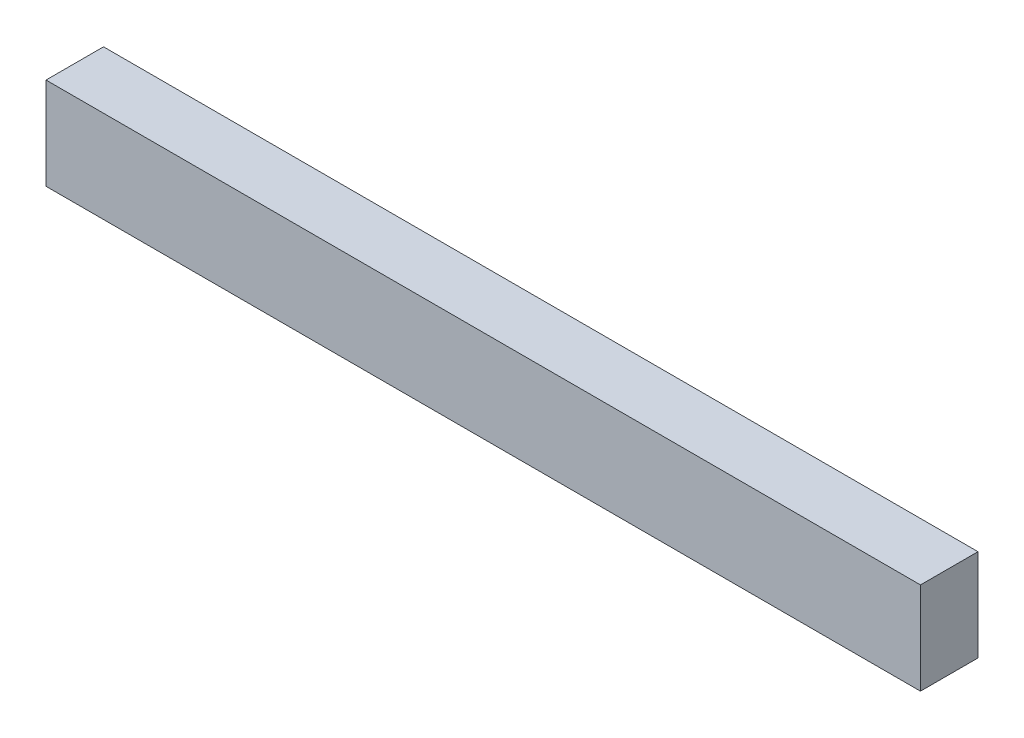
ISO-10303-21;
HEADER;
FILE_DESCRIPTION(('STEP AP214'),'2;1');
FILE_NAME('part.step','',(''),(''),'','','');
FILE_SCHEMA(('AUTOMOTIVE_DESIGN { 1 0 10303 214 1 1 1 1 }'));
ENDSEC;
DATA;
#1=APPLICATION_CONTEXT('core data for automotive mechanical design processes');
#2=APPLICATION_PROTOCOL_DEFINITION('international standard','automotive_design',2000,#1);
#3=PRODUCT_CONTEXT('',#1,'mechanical');
#4=PRODUCT('Part','Part','',(#3));
#5=PRODUCT_RELATED_PRODUCT_CATEGORY('part','',(#4));
#6=PRODUCT_DEFINITION_FORMATION('','',#4);
#7=PRODUCT_DEFINITION_CONTEXT('part definition',#1,'design');
#8=PRODUCT_DEFINITION('design','',#6,#7);
#9=PRODUCT_DEFINITION_SHAPE('','',#8);
#10=(LENGTH_UNIT() NAMED_UNIT(*) SI_UNIT(.MILLI.,.METRE.));
#11=(NAMED_UNIT(*) PLANE_ANGLE_UNIT() SI_UNIT($,.RADIAN.));
#12=(NAMED_UNIT(*) SI_UNIT($,.STERADIAN.) SOLID_ANGLE_UNIT());
#13=UNCERTAINTY_MEASURE_WITH_UNIT(LENGTH_MEASURE(1.E-05),#10,'distance_accuracy_value','');
#14=(GEOMETRIC_REPRESENTATION_CONTEXT(3) GLOBAL_UNCERTAINTY_ASSIGNED_CONTEXT((#13)) GLOBAL_UNIT_ASSIGNED_CONTEXT((#10,
#11,#12)) REPRESENTATION_CONTEXT('',''));
#15=CARTESIAN_POINT('',(0.,0.,0.));
#16=DIRECTION('',(0.,0.,1.));
#17=DIRECTION('',(1.,0.,0.));
#18=AXIS2_PLACEMENT_3D('',#15,#16,#17);
#19=CARTESIAN_POINT('',(190.,-20.,25.));
#20=DIRECTION('',(-1.,0.,0.));
#21=DIRECTION('',(0.,0.,1.));
#22=AXIS2_PLACEMENT_3D('',#19,#20,#21);
#23=PLANE('',#22);
#24=DIRECTION('',(0.,1.,0.));
#25=VECTOR('',#24,1.);
#26=CARTESIAN_POINT('',(190.,-20.,0.));
#27=LINE('',#26,#25);
#28=CARTESIAN_POINT('',(190.,-20.,0.));
#29=VERTEX_POINT('',#28);
#30=CARTESIAN_POINT('',(190.,20.,0.));
#31=VERTEX_POINT('',#30);
#32=EDGE_CURVE('E80',#29,#31,#27,.T.);
#33=ORIENTED_EDGE('',*,*,#32,.T.);
#34=DIRECTION('',(0.,0.,-1.));
#35=VECTOR('',#34,1.);
#36=CARTESIAN_POINT('',(190.,20.,25.));
#37=LINE('',#36,#35);
#38=CARTESIAN_POINT('',(190.,20.,25.));
#39=VERTEX_POINT('',#38);
#40=EDGE_CURVE('E11',#39,#31,#37,.T.);
#41=ORIENTED_EDGE('',*,*,#40,.F.);
#42=DIRECTION('',(0.,1.,0.));
#43=VECTOR('',#42,1.);
#44=CARTESIAN_POINT('',(190.,-20.,25.));
#45=LINE('',#44,#43);
#46=CARTESIAN_POINT('',(190.,-20.,25.));
#47=VERTEX_POINT('',#46);
#48=EDGE_CURVE('E68',#47,#39,#45,.T.);
#49=ORIENTED_EDGE('',*,*,#48,.F.);
#50=DIRECTION('',(0.,0.,-1.));
#51=VECTOR('',#50,1.);
#52=CARTESIAN_POINT('',(190.,-20.,25.));
#53=LINE('',#52,#51);
#54=EDGE_CURVE('E76',#47,#29,#53,.T.);
#55=ORIENTED_EDGE('',*,*,#54,.T.);
#56=EDGE_LOOP('',(#33,#41,#49,#55));
#57=FACE_BOUND('',#56,.T.);
#58=ADVANCED_FACE('F17',(#57),#23,.F.);
#59=CARTESIAN_POINT('',(-190.,20.,25.));
#60=DIRECTION('',(0.,-1.,0.));
#61=DIRECTION('',(0.,0.,-1.));
#62=AXIS2_PLACEMENT_3D('',#59,#60,#61);
#63=PLANE('',#62);
#64=DIRECTION('',(-1.,0.,0.));
#65=VECTOR('',#64,1.);
#66=CARTESIAN_POINT('',(-190.,20.,0.));
#67=LINE('',#66,#65);
#68=CARTESIAN_POINT('',(-190.,20.,0.));
#69=VERTEX_POINT('',#68);
#70=EDGE_CURVE('E72',#31,#69,#67,.T.);
#71=ORIENTED_EDGE('',*,*,#70,.T.);
#72=DIRECTION('',(0.,0.,-1.));
#73=VECTOR('',#72,1.);
#74=CARTESIAN_POINT('',(-190.,20.,25.));
#75=LINE('',#74,#73);
#76=CARTESIAN_POINT('',(-190.,20.,25.));
#77=VERTEX_POINT('',#76);
#78=EDGE_CURVE('E25',#77,#69,#75,.T.);
#79=ORIENTED_EDGE('',*,*,#78,.F.);
#80=DIRECTION('',(-1.,0.,0.));
#81=VECTOR('',#80,1.);
#82=CARTESIAN_POINT('',(-190.,20.,25.));
#83=LINE('',#82,#81);
#84=EDGE_CURVE('E63',#39,#77,#83,.T.);
#85=ORIENTED_EDGE('',*,*,#84,.F.);
#86=ORIENTED_EDGE('',*,*,#40,.T.);
#87=EDGE_LOOP('',(#71,#79,#85,#86));
#88=FACE_BOUND('',#87,.T.);
#89=ADVANCED_FACE('F71',(#88),#63,.F.);
#90=CARTESIAN_POINT('',(-190.,-20.,25.));
#91=DIRECTION('',(1.,0.,0.));
#92=DIRECTION('',(0.,0.,-1.));
#93=AXIS2_PLACEMENT_3D('',#90,#91,#92);
#94=PLANE('',#93);
#95=DIRECTION('',(0.,-1.,0.));
#96=VECTOR('',#95,1.);
#97=CARTESIAN_POINT('',(-190.,-20.,0.));
#98=LINE('',#97,#96);
#99=CARTESIAN_POINT('',(-190.,-20.,0.));
#100=VERTEX_POINT('',#99);
#101=EDGE_CURVE('E50',#69,#100,#98,.T.);
#102=ORIENTED_EDGE('',*,*,#101,.T.);
#103=DIRECTION('',(0.,0.,-1.));
#104=VECTOR('',#103,1.);
#105=CARTESIAN_POINT('',(-190.,-20.,25.));
#106=LINE('',#105,#104);
#107=CARTESIAN_POINT('',(-190.,-20.,25.));
#108=VERTEX_POINT('',#107);
#109=EDGE_CURVE('E73',#108,#100,#106,.T.);
#110=ORIENTED_EDGE('',*,*,#109,.F.);
#111=DIRECTION('',(0.,-1.,0.));
#112=VECTOR('',#111,1.);
#113=CARTESIAN_POINT('',(-190.,-20.,25.));
#114=LINE('',#113,#112);
#115=EDGE_CURVE('E66',#77,#108,#114,.T.);
#116=ORIENTED_EDGE('',*,*,#115,.F.);
#117=ORIENTED_EDGE('',*,*,#78,.T.);
#118=EDGE_LOOP('',(#102,#110,#116,#117));
#119=FACE_BOUND('',#118,.T.);
#120=ADVANCED_FACE('F74',(#119),#94,.F.);
#121=CARTESIAN_POINT('',(-190.,-20.,25.));
#122=DIRECTION('',(0.,1.,0.));
#123=DIRECTION('',(0.,0.,1.));
#124=AXIS2_PLACEMENT_3D('',#121,#122,#123);
#125=PLANE('',#124);
#126=DIRECTION('',(1.,0.,0.));
#127=VECTOR('',#126,1.);
#128=CARTESIAN_POINT('',(-190.,-20.,0.));
#129=LINE('',#128,#127);
#130=EDGE_CURVE('E56',#100,#29,#129,.T.);
#131=ORIENTED_EDGE('',*,*,#130,.T.);
#132=ORIENTED_EDGE('',*,*,#54,.F.);
#133=DIRECTION('',(1.,0.,0.));
#134=VECTOR('',#133,1.);
#135=CARTESIAN_POINT('',(-190.,-20.,25.));
#136=LINE('',#135,#134);
#137=EDGE_CURVE('E33',#108,#47,#136,.T.);
#138=ORIENTED_EDGE('',*,*,#137,.F.);
#139=ORIENTED_EDGE('',*,*,#109,.T.);
#140=EDGE_LOOP('',(#131,#132,#138,#139));
#141=FACE_BOUND('',#140,.T.);
#142=ADVANCED_FACE('F87',(#141),#125,.F.);
#143=CARTESIAN_POINT('',(0.,0.,25.));
#144=DIRECTION('',(0.,0.,-1.));
#145=DIRECTION('',(-1.,0.,0.));
#146=AXIS2_PLACEMENT_3D('',#143,#144,#145);
#147=PLANE('',#146);
#148=ORIENTED_EDGE('',*,*,#48,.T.);
#149=ORIENTED_EDGE('',*,*,#84,.T.);
#150=ORIENTED_EDGE('',*,*,#115,.T.);
#151=ORIENTED_EDGE('',*,*,#137,.T.);
#152=EDGE_LOOP('',(#148,#149,#150,#151));
#153=FACE_BOUND('',#152,.T.);
#154=ADVANCED_FACE('F64',(#153),#147,.F.);
#155=CARTESIAN_POINT('',(0.,0.,0.));
#156=DIRECTION('',(0.,0.,-1.));
#157=DIRECTION('',(-1.,0.,0.));
#158=AXIS2_PLACEMENT_3D('',#155,#156,#157);
#159=PLANE('',#158);
#160=ORIENTED_EDGE('',*,*,#32,.F.);
#161=ORIENTED_EDGE('',*,*,#130,.F.);
#162=ORIENTED_EDGE('',*,*,#101,.F.);
#163=ORIENTED_EDGE('',*,*,#70,.F.);
#164=EDGE_LOOP('',(#160,#161,#162,#163));
#165=FACE_BOUND('',#164,.T.);
#166=ADVANCED_FACE('F90',(#165),#159,.T.);
#167=CLOSED_SHELL('',(#58,#89,#120,#142,#154,#166));
#168=MANIFOLD_SOLID_BREP('B1',#167);
#169=ADVANCED_BREP_SHAPE_REPRESENTATION('',(#18,#168),#14);
#170=SHAPE_DEFINITION_REPRESENTATION(#9,#169);
ENDSEC;
END-ISO-10303-21;
